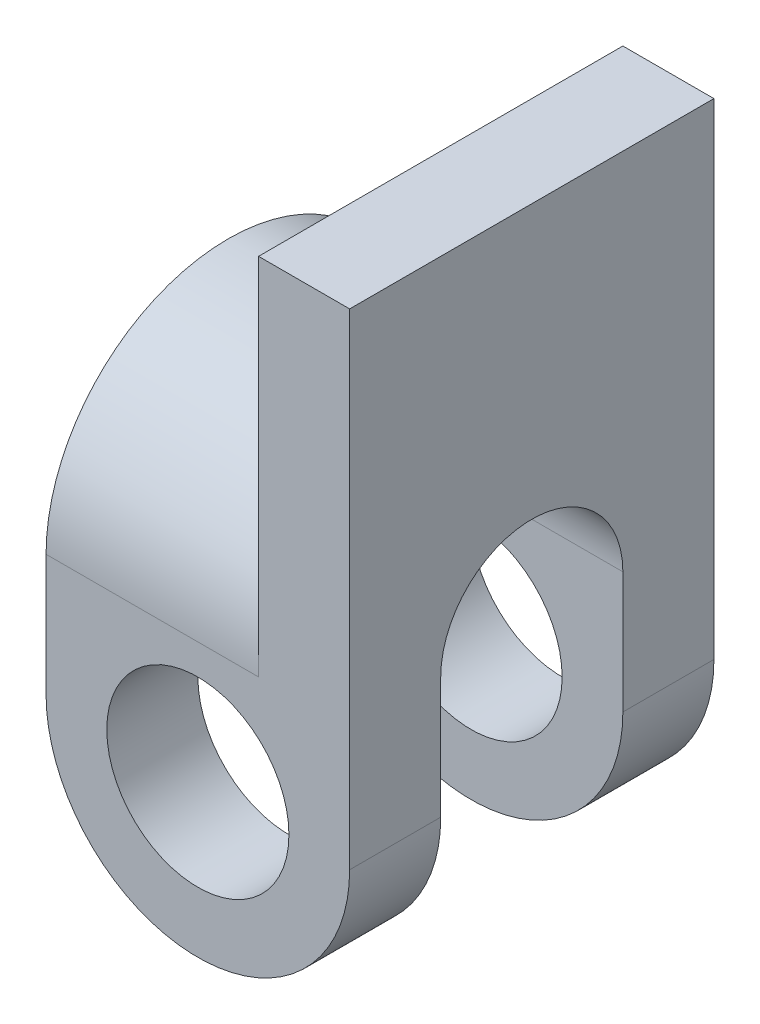
ISO-10303-21;
HEADER;
FILE_DESCRIPTION(('STEP AP214'),'2;1');
FILE_NAME('part.step','',(''),(''),'','','');
FILE_SCHEMA(('AUTOMOTIVE_DESIGN { 1 0 10303 214 1 1 1 1 }'));
ENDSEC;
DATA;
#1=APPLICATION_CONTEXT('core data for automotive mechanical design processes');
#2=APPLICATION_PROTOCOL_DEFINITION('international standard','automotive_design',2000,#1);
#3=PRODUCT_CONTEXT('',#1,'mechanical');
#4=PRODUCT('Part','Part','',(#3));
#5=PRODUCT_RELATED_PRODUCT_CATEGORY('part','',(#4));
#6=PRODUCT_DEFINITION_FORMATION('','',#4);
#7=PRODUCT_DEFINITION_CONTEXT('part definition',#1,'design');
#8=PRODUCT_DEFINITION('design','',#6,#7);
#9=PRODUCT_DEFINITION_SHAPE('','',#8);
#10=(LENGTH_UNIT() NAMED_UNIT(*) SI_UNIT(.MILLI.,.METRE.));
#11=(NAMED_UNIT(*) PLANE_ANGLE_UNIT() SI_UNIT($,.RADIAN.));
#12=(NAMED_UNIT(*) SI_UNIT($,.STERADIAN.) SOLID_ANGLE_UNIT());
#13=UNCERTAINTY_MEASURE_WITH_UNIT(LENGTH_MEASURE(1.E-05),#10,'distance_accuracy_value','');
#14=(GEOMETRIC_REPRESENTATION_CONTEXT(3) GLOBAL_UNCERTAINTY_ASSIGNED_CONTEXT((#13)) GLOBAL_UNIT_ASSIGNED_CONTEXT((#10,
#11,#12)) REPRESENTATION_CONTEXT('',''));
#15=CARTESIAN_POINT('',(0.,0.,0.));
#16=DIRECTION('',(0.,0.,1.));
#17=DIRECTION('',(1.,0.,0.));
#18=AXIS2_PLACEMENT_3D('',#15,#16,#17);
#19=CARTESIAN_POINT('',(0.,0.,60.));
#20=DIRECTION('',(0.,0.,-1.));
#21=DIRECTION('',(-1.,0.,0.));
#22=AXIS2_PLACEMENT_3D('',#19,#20,#21);
#23=CYLINDRICAL_SURFACE('',#22,25.);
#24=DIRECTION('',(0.,0.,-1.));
#25=VECTOR('',#24,1.);
#26=CARTESIAN_POINT('',(-25.,0.,60.));
#27=LINE('',#26,#25);
#28=CARTESIAN_POINT('',(-25.,0.,60.));
#29=VERTEX_POINT('',#28);
#30=CARTESIAN_POINT('',(-25.,0.,45.));
#31=VERTEX_POINT('',#30);
#32=EDGE_CURVE('E207',#29,#31,#27,.T.);
#33=ORIENTED_EDGE('',*,*,#32,.T.);
#34=CARTESIAN_POINT('',(0.,0.,45.));
#35=DIRECTION('',(0.,0.,1.));
#36=DIRECTION('',(1.,0.,0.));
#37=AXIS2_PLACEMENT_3D('',#34,#35,#36);
#38=CIRCLE('',#37,25.);
#39=CARTESIAN_POINT('',(25.,0.,45.));
#40=VERTEX_POINT('',#39);
#41=EDGE_CURVE('E156',#31,#40,#38,.T.);
#42=ORIENTED_EDGE('',*,*,#41,.T.);
#43=DIRECTION('',(0.,0.,-1.));
#44=VECTOR('',#43,1.);
#45=CARTESIAN_POINT('',(25.,0.,60.));
#46=LINE('',#45,#44);
#47=CARTESIAN_POINT('',(25.,0.,60.));
#48=VERTEX_POINT('',#47);
#49=EDGE_CURVE('E11',#48,#40,#46,.T.);
#50=ORIENTED_EDGE('',*,*,#49,.F.);
#51=CARTESIAN_POINT('',(0.,0.,60.));
#52=DIRECTION('',(0.,0.,1.));
#53=DIRECTION('',(1.,0.,0.));
#54=AXIS2_PLACEMENT_3D('',#51,#52,#53);
#55=CIRCLE('',#54,25.);
#56=EDGE_CURVE('E172',#29,#48,#55,.T.);
#57=ORIENTED_EDGE('',*,*,#56,.F.);
#58=EDGE_LOOP('',(#33,#42,#50,#57));
#59=FACE_BOUND('',#58,.T.);
#60=ADVANCED_FACE('F40',(#59),#23,.T.);
#61=CARTESIAN_POINT('',(0.,0.,60.));
#62=DIRECTION('',(0.,0.,-1.));
#63=DIRECTION('',(-1.,0.,0.));
#64=AXIS2_PLACEMENT_3D('',#61,#62,#63);
#65=CYLINDRICAL_SURFACE('',#64,15.);
#66=CARTESIAN_POINT('',(0.,0.,45.));
#67=DIRECTION('',(0.,0.,1.));
#68=DIRECTION('',(1.,0.,0.));
#69=AXIS2_PLACEMENT_3D('',#66,#67,#68);
#70=CIRCLE('',#69,15.);
#71=CARTESIAN_POINT('',(15.,0.,45.));
#72=VERTEX_POINT('',#71);
#73=EDGE_CURVE('E264',#72,#72,#70,.T.);
#74=ORIENTED_EDGE('',*,*,#73,.F.);
#75=EDGE_LOOP('',(#74));
#76=FACE_BOUND('',#75,.T.);
#77=CARTESIAN_POINT('',(0.,0.,60.));
#78=DIRECTION('',(0.,0.,1.));
#79=DIRECTION('',(1.,0.,0.));
#80=AXIS2_PLACEMENT_3D('',#77,#78,#79);
#81=CIRCLE('',#80,15.);
#82=CARTESIAN_POINT('',(15.,0.,60.));
#83=VERTEX_POINT('',#82);
#84=EDGE_CURVE('E164',#83,#83,#81,.T.);
#85=ORIENTED_EDGE('',*,*,#84,.T.);
#86=EDGE_LOOP('',(#85));
#87=FACE_BOUND('',#86,.T.);
#88=ADVANCED_FACE('F239',(#76,#87),#65,.F.);
#89=CARTESIAN_POINT('',(10.,80.,60.));
#90=DIRECTION('',(1.,0.,0.));
#91=DIRECTION('',(0.,1.,0.));
#92=AXIS2_PLACEMENT_3D('',#89,#90,#91);
#93=PLANE('',#92);
#94=DIRECTION('',(0.,-1.,0.));
#95=VECTOR('',#94,1.);
#96=CARTESIAN_POINT('',(10.,80.,0.));
#97=LINE('',#96,#95);
#98=CARTESIAN_POINT('',(10.,80.,0.));
#99=VERTEX_POINT('',#98);
#100=CARTESIAN_POINT('',(10.,20.,0.));
#101=VERTEX_POINT('',#100);
#102=EDGE_CURVE('E198',#99,#101,#97,.T.);
#103=ORIENTED_EDGE('',*,*,#102,.T.);
#104=CARTESIAN_POINT('',(10.,20.,30.));
#105=DIRECTION('',(1.,0.,0.));
#106=DIRECTION('',(0.,1.,0.));
#107=AXIS2_PLACEMENT_3D('',#104,#105,#106);
#108=CIRCLE('',#107,30.);
#109=CARTESIAN_POINT('',(10.,20.,60.));
#110=VERTEX_POINT('',#109);
#111=EDGE_CURVE('E139',#110,#101,#108,.F.);
#112=ORIENTED_EDGE('',*,*,#111,.F.);
#113=DIRECTION('',(0.,-1.,0.));
#114=VECTOR('',#113,1.);
#115=CARTESIAN_POINT('',(10.,80.,60.));
#116=LINE('',#115,#114);
#117=CARTESIAN_POINT('',(10.,80.,60.));
#118=VERTEX_POINT('',#117);
#119=EDGE_CURVE('E181',#118,#110,#116,.T.);
#120=ORIENTED_EDGE('',*,*,#119,.F.);
#121=DIRECTION('',(0.,0.,-1.));
#122=VECTOR('',#121,1.);
#123=CARTESIAN_POINT('',(10.,80.,60.));
#124=LINE('',#123,#122);
#125=EDGE_CURVE('E211',#118,#99,#124,.T.);
#126=ORIENTED_EDGE('',*,*,#125,.T.);
#127=EDGE_LOOP('',(#103,#112,#120,#126));
#128=FACE_BOUND('',#127,.T.);
#129=ADVANCED_FACE('F244',(#128),#93,.F.);
#130=CARTESIAN_POINT('',(0.,0.,60.));
#131=DIRECTION('',(0.,0.,1.));
#132=DIRECTION('',(1.,0.,0.));
#133=AXIS2_PLACEMENT_3D('',#130,#131,#132);
#134=PLANE('',#133);
#135=ORIENTED_EDGE('',*,*,#56,.T.);
#136=DIRECTION('',(0.,1.,0.));
#137=VECTOR('',#136,1.);
#138=CARTESIAN_POINT('',(25.,0.,60.));
#139=LINE('',#138,#137);
#140=CARTESIAN_POINT('',(25.,80.,60.));
#141=VERTEX_POINT('',#140);
#142=EDGE_CURVE('E93',#48,#141,#139,.T.);
#143=ORIENTED_EDGE('',*,*,#142,.T.);
#144=DIRECTION('',(-1.,0.,0.));
#145=VECTOR('',#144,1.);
#146=CARTESIAN_POINT('',(25.,80.,60.));
#147=LINE('',#146,#145);
#148=EDGE_CURVE('E178',#141,#118,#147,.T.);
#149=ORIENTED_EDGE('',*,*,#148,.T.);
#150=ORIENTED_EDGE('',*,*,#119,.T.);
#151=DIRECTION('',(-1.,0.,0.));
#152=VECTOR('',#151,1.);
#153=CARTESIAN_POINT('',(-25.,20.,60.));
#154=LINE('',#153,#152);
#155=CARTESIAN_POINT('',(-25.,20.,60.));
#156=VERTEX_POINT('',#155);
#157=EDGE_CURVE('E185',#110,#156,#154,.T.);
#158=ORIENTED_EDGE('',*,*,#157,.T.);
#159=DIRECTION('',(0.,-1.,0.));
#160=VECTOR('',#159,1.);
#161=CARTESIAN_POINT('',(-25.,20.,60.));
#162=LINE('',#161,#160);
#163=EDGE_CURVE('E58',#156,#29,#162,.T.);
#164=ORIENTED_EDGE('',*,*,#163,.T.);
#165=EDGE_LOOP('',(#135,#143,#149,#150,#158,#164));
#166=FACE_BOUND('',#165,.T.);
#167=ORIENTED_EDGE('',*,*,#84,.F.);
#168=EDGE_LOOP('',(#167));
#169=FACE_BOUND('',#168,.T.);
#170=ADVANCED_FACE('F236',(#166,#169),#134,.T.);
#171=CARTESIAN_POINT('',(0.,0.,0.));
#172=DIRECTION('',(0.,0.,1.));
#173=DIRECTION('',(1.,0.,0.));
#174=AXIS2_PLACEMENT_3D('',#171,#172,#173);
#175=PLANE('',#174);
#176=CARTESIAN_POINT('',(0.,0.,0.));
#177=DIRECTION('',(0.,0.,1.));
#178=DIRECTION('',(1.,0.,0.));
#179=AXIS2_PLACEMENT_3D('',#176,#177,#178);
#180=CIRCLE('',#179,25.);
#181=CARTESIAN_POINT('',(-25.,0.,0.));
#182=VERTEX_POINT('',#181);
#183=CARTESIAN_POINT('',(25.,0.,0.));
#184=VERTEX_POINT('',#183);
#185=EDGE_CURVE('E168',#182,#184,#180,.T.);
#186=ORIENTED_EDGE('',*,*,#185,.F.);
#187=DIRECTION('',(0.,-1.,0.));
#188=VECTOR('',#187,1.);
#189=CARTESIAN_POINT('',(-25.,20.,0.));
#190=LINE('',#189,#188);
#191=CARTESIAN_POINT('',(-25.,20.,0.));
#192=VERTEX_POINT('',#191);
#193=EDGE_CURVE('E175',#192,#182,#190,.T.);
#194=ORIENTED_EDGE('',*,*,#193,.F.);
#195=DIRECTION('',(-1.,0.,0.));
#196=VECTOR('',#195,1.);
#197=CARTESIAN_POINT('',(-25.,20.,0.));
#198=LINE('',#197,#196);
#199=EDGE_CURVE('E202',#101,#192,#198,.T.);
#200=ORIENTED_EDGE('',*,*,#199,.F.);
#201=ORIENTED_EDGE('',*,*,#102,.F.);
#202=DIRECTION('',(-1.,0.,0.));
#203=VECTOR('',#202,1.);
#204=CARTESIAN_POINT('',(25.,80.,0.));
#205=LINE('',#204,#203);
#206=CARTESIAN_POINT('',(25.,80.,0.));
#207=VERTEX_POINT('',#206);
#208=EDGE_CURVE('E195',#207,#99,#205,.T.);
#209=ORIENTED_EDGE('',*,*,#208,.F.);
#210=DIRECTION('',(0.,1.,0.));
#211=VECTOR('',#210,1.);
#212=CARTESIAN_POINT('',(25.,0.,0.));
#213=LINE('',#212,#211);
#214=EDGE_CURVE('E192',#184,#207,#213,.T.);
#215=ORIENTED_EDGE('',*,*,#214,.F.);
#216=EDGE_LOOP('',(#186,#194,#200,#201,#209,#215));
#217=FACE_BOUND('',#216,.T.);
#218=CARTESIAN_POINT('',(0.,0.,0.));
#219=DIRECTION('',(0.,0.,1.));
#220=DIRECTION('',(1.,0.,0.));
#221=AXIS2_PLACEMENT_3D('',#218,#219,#220);
#222=CIRCLE('',#221,15.);
#223=CARTESIAN_POINT('',(15.,0.,0.));
#224=VERTEX_POINT('',#223);
#225=EDGE_CURVE('E163',#224,#224,#222,.T.);
#226=ORIENTED_EDGE('',*,*,#225,.T.);
#227=EDGE_LOOP('',(#226));
#228=FACE_BOUND('',#227,.T.);
#229=ADVANCED_FACE('F226',(#217,#228),#175,.F.);
#230=CARTESIAN_POINT('',(25.,0.,15.));
#231=VERTEX_POINT('',#230);
#232=EDGE_CURVE('E50',#231,#184,#46,.T.);
#233=ORIENTED_EDGE('',*,*,#232,.F.);
#234=CARTESIAN_POINT('',(0.,0.,15.));
#235=DIRECTION('',(0.,0.,-1.));
#236=DIRECTION('',(-1.,0.,0.));
#237=AXIS2_PLACEMENT_3D('',#234,#235,#236);
#238=CIRCLE('',#237,25.);
#239=CARTESIAN_POINT('',(-25.,0.,15.));
#240=VERTEX_POINT('',#239);
#241=EDGE_CURVE('E261',#231,#240,#238,.T.);
#242=ORIENTED_EDGE('',*,*,#241,.T.);
#243=EDGE_CURVE('E87',#240,#182,#27,.T.);
#244=ORIENTED_EDGE('',*,*,#243,.T.);
#245=ORIENTED_EDGE('',*,*,#185,.T.);
#246=EDGE_LOOP('',(#233,#242,#244,#245));
#247=FACE_BOUND('',#246,.T.);
#248=ADVANCED_FACE('F42',(#247),#23,.T.);
#249=CARTESIAN_POINT('',(25.,0.,60.));
#250=DIRECTION('',(-1.,0.,0.));
#251=DIRECTION('',(0.,0.,1.));
#252=AXIS2_PLACEMENT_3D('',#249,#250,#251);
#253=PLANE('',#252);
#254=ORIENTED_EDGE('',*,*,#49,.T.);
#255=DIRECTION('',(0.,1.,0.));
#256=VECTOR('',#255,1.);
#257=CARTESIAN_POINT('',(25.,0.,45.));
#258=LINE('',#257,#256);
#259=CARTESIAN_POINT('',(25.,20.,45.));
#260=VERTEX_POINT('',#259);
#261=EDGE_CURVE('E268',#40,#260,#258,.T.);
#262=ORIENTED_EDGE('',*,*,#261,.T.);
#263=CARTESIAN_POINT('',(25.,20.,30.));
#264=DIRECTION('',(-1.,0.,0.));
#265=DIRECTION('',(0.,0.,1.));
#266=AXIS2_PLACEMENT_3D('',#263,#264,#265);
#267=CIRCLE('',#266,15.);
#268=CARTESIAN_POINT('',(25.,20.,15.));
#269=VERTEX_POINT('',#268);
#270=EDGE_CURVE('E151',#260,#269,#267,.T.);
#271=ORIENTED_EDGE('',*,*,#270,.T.);
#272=DIRECTION('',(0.,-1.,0.));
#273=VECTOR('',#272,1.);
#274=CARTESIAN_POINT('',(25.,0.,15.));
#275=LINE('',#274,#273);
#276=EDGE_CURVE('E132',#269,#231,#275,.T.);
#277=ORIENTED_EDGE('',*,*,#276,.T.);
#278=ORIENTED_EDGE('',*,*,#232,.T.);
#279=ORIENTED_EDGE('',*,*,#214,.T.);
#280=DIRECTION('',(0.,0.,-1.));
#281=VECTOR('',#280,1.);
#282=CARTESIAN_POINT('',(25.,80.,60.));
#283=LINE('',#282,#281);
#284=EDGE_CURVE('E214',#141,#207,#283,.T.);
#285=ORIENTED_EDGE('',*,*,#284,.F.);
#286=ORIENTED_EDGE('',*,*,#142,.F.);
#287=EDGE_LOOP('',(#254,#262,#271,#277,#278,#279,#285,#286));
#288=FACE_BOUND('',#287,.T.);
#289=ADVANCED_FACE('F223',(#288),#253,.F.);
#290=CARTESIAN_POINT('',(25.,80.,60.));
#291=DIRECTION('',(0.,-1.,0.));
#292=DIRECTION('',(0.,0.,-1.));
#293=AXIS2_PLACEMENT_3D('',#290,#291,#292);
#294=PLANE('',#293);
#295=ORIENTED_EDGE('',*,*,#208,.T.);
#296=ORIENTED_EDGE('',*,*,#125,.F.);
#297=ORIENTED_EDGE('',*,*,#148,.F.);
#298=ORIENTED_EDGE('',*,*,#284,.T.);
#299=EDGE_LOOP('',(#295,#296,#297,#298));
#300=FACE_BOUND('',#299,.T.);
#301=ADVANCED_FACE('F235',(#300),#294,.F.);
#302=CARTESIAN_POINT('',(-25.,20.,60.));
#303=DIRECTION('',(1.,0.,0.));
#304=DIRECTION('',(0.,1.,0.));
#305=AXIS2_PLACEMENT_3D('',#302,#303,#304);
#306=PLANE('',#305);
#307=CARTESIAN_POINT('',(-25.,20.,30.));
#308=DIRECTION('',(1.,0.,0.));
#309=DIRECTION('',(0.,-1.,0.));
#310=AXIS2_PLACEMENT_3D('',#307,#308,#309);
#311=CIRCLE('',#310,15.);
#312=CARTESIAN_POINT('',(-25.,20.,15.));
#313=VERTEX_POINT('',#312);
#314=CARTESIAN_POINT('',(-25.,20.,45.));
#315=VERTEX_POINT('',#314);
#316=EDGE_CURVE('E144',#313,#315,#311,.T.);
#317=ORIENTED_EDGE('',*,*,#316,.T.);
#318=DIRECTION('',(0.,1.,0.));
#319=VECTOR('',#318,1.);
#320=CARTESIAN_POINT('',(-25.,20.,45.));
#321=LINE('',#320,#319);
#322=EDGE_CURVE('E146',#31,#315,#321,.T.);
#323=ORIENTED_EDGE('',*,*,#322,.F.);
#324=ORIENTED_EDGE('',*,*,#32,.F.);
#325=ORIENTED_EDGE('',*,*,#163,.F.);
#326=CARTESIAN_POINT('',(-25.,20.,30.));
#327=DIRECTION('',(-1.,0.,0.));
#328=DIRECTION('',(0.,-1.,0.));
#329=AXIS2_PLACEMENT_3D('',#326,#327,#328);
#330=CIRCLE('',#329,30.);
#331=EDGE_CURVE('E79',#156,#192,#330,.T.);
#332=ORIENTED_EDGE('',*,*,#331,.T.);
#333=ORIENTED_EDGE('',*,*,#193,.T.);
#334=ORIENTED_EDGE('',*,*,#243,.F.);
#335=DIRECTION('',(0.,-1.,0.));
#336=VECTOR('',#335,1.);
#337=CARTESIAN_POINT('',(-25.,20.,15.));
#338=LINE('',#337,#336);
#339=EDGE_CURVE('E130',#313,#240,#338,.T.);
#340=ORIENTED_EDGE('',*,*,#339,.F.);
#341=EDGE_LOOP('',(#317,#323,#324,#325,#332,#333,#334,#340));
#342=FACE_BOUND('',#341,.T.);
#343=ADVANCED_FACE('F142',(#342),#306,.F.);
#344=CARTESIAN_POINT('',(0.,0.,15.));
#345=DIRECTION('',(0.,0.,-1.));
#346=DIRECTION('',(-1.,0.,0.));
#347=AXIS2_PLACEMENT_3D('',#344,#345,#346);
#348=CIRCLE('',#347,15.);
#349=CARTESIAN_POINT('',(-15.,0.,15.));
#350=VERTEX_POINT('',#349);
#351=EDGE_CURVE('E253',#350,#350,#348,.T.);
#352=ORIENTED_EDGE('',*,*,#351,.F.);
#353=EDGE_LOOP('',(#352));
#354=FACE_BOUND('',#353,.T.);
#355=ORIENTED_EDGE('',*,*,#225,.F.);
#356=EDGE_LOOP('',(#355));
#357=FACE_BOUND('',#356,.T.);
#358=ADVANCED_FACE('F247',(#354,#357),#65,.F.);
#359=CARTESIAN_POINT('',(77.0820393249937,20.,30.));
#360=DIRECTION('',(-1.,0.,0.));
#361=DIRECTION('',(0.,-1.,0.));
#362=AXIS2_PLACEMENT_3D('',#359,#360,#361);
#363=CYLINDRICAL_SURFACE('',#362,30.);
#364=ORIENTED_EDGE('',*,*,#157,.F.);
#365=ORIENTED_EDGE('',*,*,#111,.T.);
#366=ORIENTED_EDGE('',*,*,#199,.T.);
#367=ORIENTED_EDGE('',*,*,#331,.F.);
#368=EDGE_LOOP('',(#364,#365,#366,#367));
#369=FACE_BOUND('',#368,.T.);
#370=ADVANCED_FACE('F283',(#369),#363,.T.);
#371=CARTESIAN_POINT('',(77.0820393249937,20.,30.));
#372=DIRECTION('',(-1.,0.,0.));
#373=DIRECTION('',(0.,-1.,0.));
#374=AXIS2_PLACEMENT_3D('',#371,#372,#373);
#375=CYLINDRICAL_SURFACE('',#374,15.);
#376=DIRECTION('',(-1.,0.,0.));
#377=VECTOR('',#376,1.);
#378=CARTESIAN_POINT('',(77.0820393249937,20.,15.));
#379=LINE('',#378,#377);
#380=EDGE_CURVE('E127',#269,#313,#379,.T.);
#381=ORIENTED_EDGE('',*,*,#380,.F.);
#382=ORIENTED_EDGE('',*,*,#270,.F.);
#383=DIRECTION('',(-1.,0.,0.));
#384=VECTOR('',#383,1.);
#385=CARTESIAN_POINT('',(77.0820393249937,20.,45.));
#386=LINE('',#385,#384);
#387=EDGE_CURVE('E138',#260,#315,#386,.T.);
#388=ORIENTED_EDGE('',*,*,#387,.T.);
#389=ORIENTED_EDGE('',*,*,#316,.F.);
#390=EDGE_LOOP('',(#381,#382,#388,#389));
#391=FACE_BOUND('',#390,.T.);
#392=ADVANCED_FACE('F149',(#391),#375,.F.);
#393=CARTESIAN_POINT('',(43.,20.,45.));
#394=DIRECTION('',(0.,0.,1.));
#395=DIRECTION('',(1.,0.,0.));
#396=AXIS2_PLACEMENT_3D('',#393,#394,#395);
#397=PLANE('',#396);
#398=ORIENTED_EDGE('',*,*,#73,.T.);
#399=EDGE_LOOP('',(#398));
#400=FACE_BOUND('',#399,.T.);
#401=ORIENTED_EDGE('',*,*,#322,.T.);
#402=ORIENTED_EDGE('',*,*,#387,.F.);
#403=ORIENTED_EDGE('',*,*,#261,.F.);
#404=ORIENTED_EDGE('',*,*,#41,.F.);
#405=EDGE_LOOP('',(#401,#402,#403,#404));
#406=FACE_BOUND('',#405,.T.);
#407=ADVANCED_FACE('F273',(#400,#406),#397,.F.);
#408=CARTESIAN_POINT('',(43.,20.,15.));
#409=DIRECTION('',(0.,0.,-1.));
#410=DIRECTION('',(-1.,0.,0.));
#411=AXIS2_PLACEMENT_3D('',#408,#409,#410);
#412=PLANE('',#411);
#413=ORIENTED_EDGE('',*,*,#351,.T.);
#414=EDGE_LOOP('',(#413));
#415=FACE_BOUND('',#414,.T.);
#416=ORIENTED_EDGE('',*,*,#276,.F.);
#417=ORIENTED_EDGE('',*,*,#380,.T.);
#418=ORIENTED_EDGE('',*,*,#339,.T.);
#419=ORIENTED_EDGE('',*,*,#241,.F.);
#420=EDGE_LOOP('',(#416,#417,#418,#419));
#421=FACE_BOUND('',#420,.T.);
#422=ADVANCED_FACE('F129',(#415,#421),#412,.F.);
#423=CLOSED_SHELL('',(#60,#88,#129,#170,#229,#248,#289,#301,#343,#358,#370,#392,#407,#422));
#424=MANIFOLD_SOLID_BREP('B2',#423);
#425=ADVANCED_BREP_SHAPE_REPRESENTATION('',(#18,#424),#14);
#426=SHAPE_DEFINITION_REPRESENTATION(#9,#425);
ENDSEC;
END-ISO-10303-21;
